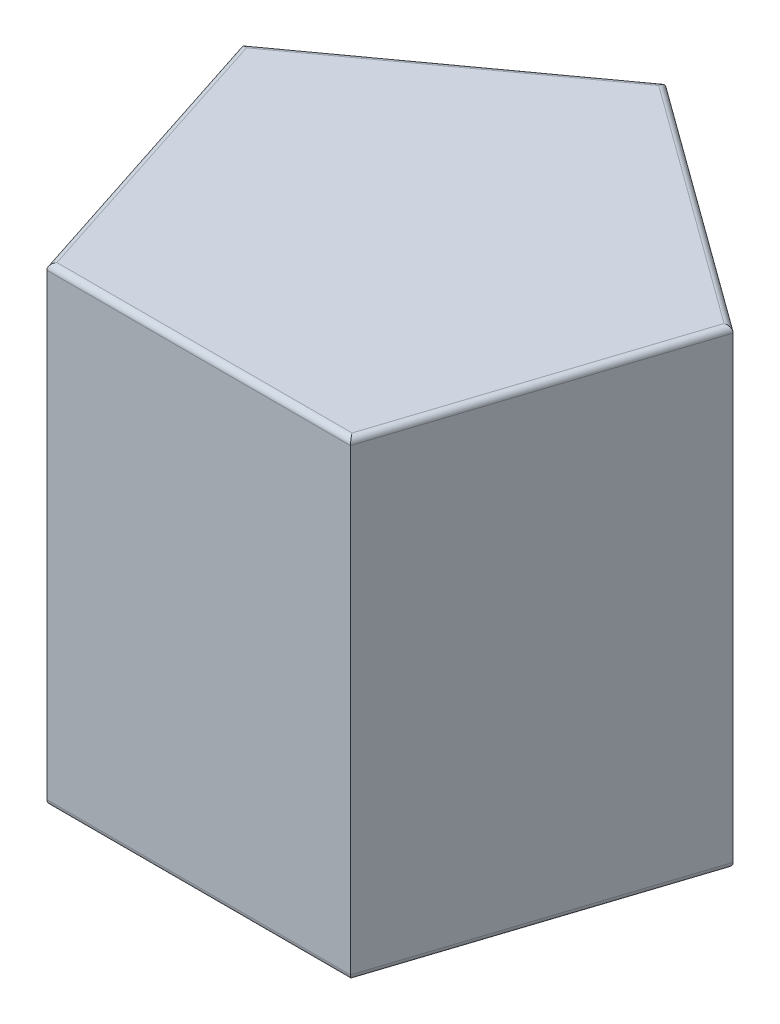
ISO-10303-21;
HEADER;
FILE_DESCRIPTION(('STEP AP214'),'2;1');
FILE_NAME('part.step','',(''),(''),'','','');
FILE_SCHEMA(('AUTOMOTIVE_DESIGN { 1 0 10303 214 1 1 1 1 }'));
ENDSEC;
DATA;
#1=APPLICATION_CONTEXT('core data for automotive mechanical design processes');
#2=APPLICATION_PROTOCOL_DEFINITION('international standard','automotive_design',2000,#1);
#3=PRODUCT_CONTEXT('',#1,'mechanical');
#4=PRODUCT('Part','Part','',(#3));
#5=PRODUCT_RELATED_PRODUCT_CATEGORY('part','',(#4));
#6=PRODUCT_DEFINITION_FORMATION('','',#4);
#7=PRODUCT_DEFINITION_CONTEXT('part definition',#1,'design');
#8=PRODUCT_DEFINITION('design','',#6,#7);
#9=PRODUCT_DEFINITION_SHAPE('','',#8);
#10=(LENGTH_UNIT() NAMED_UNIT(*) SI_UNIT(.MILLI.,.METRE.));
#11=(NAMED_UNIT(*) PLANE_ANGLE_UNIT() SI_UNIT($,.RADIAN.));
#12=(NAMED_UNIT(*) SI_UNIT($,.STERADIAN.) SOLID_ANGLE_UNIT());
#13=UNCERTAINTY_MEASURE_WITH_UNIT(LENGTH_MEASURE(1.E-05),#10,'distance_accuracy_value','');
#14=(GEOMETRIC_REPRESENTATION_CONTEXT(3) GLOBAL_UNCERTAINTY_ASSIGNED_CONTEXT((#13)) GLOBAL_UNIT_ASSIGNED_CONTEXT((#10,
#11,#12)) REPRESENTATION_CONTEXT('',''));
#15=CARTESIAN_POINT('',(0.,0.,0.));
#16=DIRECTION('',(0.,0.,1.));
#17=DIRECTION('',(1.,0.,0.));
#18=AXIS2_PLACEMENT_3D('',#15,#16,#17);
#19=CARTESIAN_POINT('',(12.9200844857088,40.,17.782971123159));
#20=DIRECTION('',(0.,0.,-1.));
#21=DIRECTION('',(-1.,0.,0.));
#22=AXIS2_PLACEMENT_3D('',#19,#20,#21);
#23=PLANE('',#22);
#24=DIRECTION('',(0.,-1.,0.));
#25=VECTOR('',#24,1.);
#26=CARTESIAN_POINT('',(-12.9200849418446,40.,17.782971123159));
#27=LINE('',#26,#25);
#28=CARTESIAN_POINT('',(-12.9200849418446,39.5,17.782971123159));
#29=VERTEX_POINT('',#28);
#30=CARTESIAN_POINT('',(-12.9200849418446,0.5,17.782971123159));
#31=VERTEX_POINT('',#30);
#32=EDGE_CURVE('E185',#29,#31,#27,.T.);
#33=ORIENTED_EDGE('',*,*,#32,.T.);
#34=DIRECTION('',(1.,0.,0.));
#35=VECTOR('',#34,1.);
#36=CARTESIAN_POINT('',(12.9200844857088,0.5,17.782971123159));
#37=LINE('',#36,#35);
#38=CARTESIAN_POINT('',(12.9200844857088,0.5,17.782971123159));
#39=VERTEX_POINT('',#38);
#40=EDGE_CURVE('E142',#31,#39,#37,.T.);
#41=ORIENTED_EDGE('',*,*,#40,.T.);
#42=DIRECTION('',(0.,-1.,0.));
#43=VECTOR('',#42,1.);
#44=CARTESIAN_POINT('',(12.9200844857088,40.,17.782971123159));
#45=LINE('',#44,#43);
#46=CARTESIAN_POINT('',(12.9200844857088,39.5,17.782971123159));
#47=VERTEX_POINT('',#46);
#48=EDGE_CURVE('E126',#47,#39,#45,.T.);
#49=ORIENTED_EDGE('',*,*,#48,.F.);
#50=DIRECTION('',(1.,0.,0.));
#51=VECTOR('',#50,1.);
#52=CARTESIAN_POINT('',(12.9200844857088,39.5,17.782971123159));
#53=LINE('',#52,#51);
#54=EDGE_CURVE('E139',#47,#29,#53,.F.);
#55=ORIENTED_EDGE('',*,*,#54,.T.);
#56=EDGE_LOOP('',(#33,#41,#49,#55));
#57=FACE_BOUND('',#56,.T.);
#58=ADVANCED_FACE('F43',(#57),#23,.F.);
#59=CARTESIAN_POINT('',(20.9051359763508,40.,-6.79249039308646));
#60=DIRECTION('',(-0.951056516295154,0.,-0.309016994374947));
#61=DIRECTION('',(-0.309016994374947,0.,0.951056516295154));
#62=AXIS2_PLACEMENT_3D('',#59,#60,#61);
#63=PLANE('',#62);
#64=ORIENTED_EDGE('',*,*,#48,.T.);
#65=DIRECTION('',(0.309016994374947,0.,-0.951056516295154));
#66=VECTOR('',#65,1.);
#67=CARTESIAN_POINT('',(20.9051359763508,0.5,-6.79249039308646));
#68=LINE('',#67,#66);
#69=CARTESIAN_POINT('',(20.9051359763508,0.5,-6.79249039308646));
#70=VERTEX_POINT('',#69);
#71=EDGE_CURVE('E132',#39,#70,#68,.T.);
#72=ORIENTED_EDGE('',*,*,#71,.T.);
#73=DIRECTION('',(0.,-1.,0.));
#74=VECTOR('',#73,1.);
#75=CARTESIAN_POINT('',(20.9051359763508,40.,-6.79249039308646));
#76=LINE('',#75,#74);
#77=CARTESIAN_POINT('',(20.9051359763508,39.5,-6.79249039308646));
#78=VERTEX_POINT('',#77);
#79=EDGE_CURVE('E128',#78,#70,#76,.T.);
#80=ORIENTED_EDGE('',*,*,#79,.F.);
#81=DIRECTION('',(0.309016994374947,0.,-0.951056516295154));
#82=VECTOR('',#81,1.);
#83=CARTESIAN_POINT('',(20.9051359763508,39.5,-6.79249039308646));
#84=LINE('',#83,#82);
#85=EDGE_CURVE('E123',#78,#47,#84,.F.);
#86=ORIENTED_EDGE('',*,*,#85,.T.);
#87=EDGE_LOOP('',(#64,#72,#80,#86));
#88=FACE_BOUND('',#87,.T.);
#89=ADVANCED_FACE('F125',(#88),#63,.F.);
#90=CARTESIAN_POINT('',(-2.28067847105658E-07,40.,-21.9809608993412));
#91=DIRECTION('',(-0.587785252292473,0.,0.809016994374947));
#92=DIRECTION('',(0.809016994374947,0.,0.587785252292473));
#93=AXIS2_PLACEMENT_3D('',#90,#91,#92);
#94=PLANE('',#93);
#95=ORIENTED_EDGE('',*,*,#79,.T.);
#96=DIRECTION('',(-0.809016994374947,0.,-0.587785252292473));
#97=VECTOR('',#96,1.);
#98=CARTESIAN_POINT('',(-2.28067847141139E-07,0.5,-21.9809608993412));
#99=LINE('',#98,#97);
#100=CARTESIAN_POINT('',(-2.28067847105658E-07,0.5,-21.9809608993412));
#101=VERTEX_POINT('',#100);
#102=EDGE_CURVE('E214',#70,#101,#99,.T.);
#103=ORIENTED_EDGE('',*,*,#102,.T.);
#104=DIRECTION('',(0.,-1.,0.));
#105=VECTOR('',#104,1.);
#106=CARTESIAN_POINT('',(-2.28067847105658E-07,40.,-21.9809608993412));
#107=LINE('',#106,#105);
#108=CARTESIAN_POINT('',(-2.28067847105658E-07,39.5,-21.9809608993412));
#109=VERTEX_POINT('',#108);
#110=EDGE_CURVE('E194',#109,#101,#107,.T.);
#111=ORIENTED_EDGE('',*,*,#110,.F.);
#112=DIRECTION('',(-0.809016994374947,0.,-0.587785252292473));
#113=VECTOR('',#112,1.);
#114=CARTESIAN_POINT('',(-2.28067847105658E-07,39.5,-21.9809608993412));
#115=LINE('',#114,#113);
#116=EDGE_CURVE('E212',#109,#78,#115,.F.);
#117=ORIENTED_EDGE('',*,*,#116,.T.);
#118=EDGE_LOOP('',(#95,#103,#111,#117));
#119=FACE_BOUND('',#118,.T.);
#120=ADVANCED_FACE('F261',(#119),#94,.F.);
#121=CARTESIAN_POINT('',(-20.9051364324865,40.,-6.79249039308645));
#122=DIRECTION('',(0.587785252292473,0.,0.809016994374947));
#123=DIRECTION('',(0.809016994374947,0.,-0.587785252292473));
#124=AXIS2_PLACEMENT_3D('',#121,#122,#123);
#125=PLANE('',#124);
#126=ORIENTED_EDGE('',*,*,#110,.T.);
#127=DIRECTION('',(-0.809016994374947,0.,0.587785252292473));
#128=VECTOR('',#127,1.);
#129=CARTESIAN_POINT('',(-20.9051364324865,0.5,-6.79249039308645));
#130=LINE('',#129,#128);
#131=CARTESIAN_POINT('',(-20.9051364324865,0.5,-6.79249039308645));
#132=VERTEX_POINT('',#131);
#133=EDGE_CURVE('E218',#101,#132,#130,.T.);
#134=ORIENTED_EDGE('',*,*,#133,.T.);
#135=DIRECTION('',(0.,-1.,0.));
#136=VECTOR('',#135,1.);
#137=CARTESIAN_POINT('',(-20.9051364324865,40.,-6.79249039308645));
#138=LINE('',#137,#136);
#139=CARTESIAN_POINT('',(-20.9051364324865,39.5,-6.79249039308645));
#140=VERTEX_POINT('',#139);
#141=EDGE_CURVE('E190',#140,#132,#138,.T.);
#142=ORIENTED_EDGE('',*,*,#141,.F.);
#143=DIRECTION('',(-0.809016994374947,0.,0.587785252292473));
#144=VECTOR('',#143,1.);
#145=CARTESIAN_POINT('',(-20.9051364324865,39.5,-6.79249039308645));
#146=LINE('',#145,#144);
#147=EDGE_CURVE('E216',#140,#109,#146,.F.);
#148=ORIENTED_EDGE('',*,*,#147,.T.);
#149=EDGE_LOOP('',(#126,#134,#142,#148));
#150=FACE_BOUND('',#149,.T.);
#151=ADVANCED_FACE('F238',(#150),#125,.F.);
#152=CARTESIAN_POINT('',(-12.9200849418446,40.,17.782971123159));
#153=DIRECTION('',(0.951056516295154,0.,-0.309016994374946));
#154=DIRECTION('',(-0.309016994374946,0.,-0.951056516295154));
#155=AXIS2_PLACEMENT_3D('',#152,#153,#154);
#156=PLANE('',#155);
#157=ORIENTED_EDGE('',*,*,#141,.T.);
#158=DIRECTION('',(0.309016994374946,0.,0.951056516295154));
#159=VECTOR('',#158,1.);
#160=CARTESIAN_POINT('',(-12.9200849418446,0.5,17.782971123159));
#161=LINE('',#160,#159);
#162=EDGE_CURVE('E222',#132,#31,#161,.T.);
#163=ORIENTED_EDGE('',*,*,#162,.T.);
#164=ORIENTED_EDGE('',*,*,#32,.F.);
#165=DIRECTION('',(0.309016994374946,0.,0.951056516295154));
#166=VECTOR('',#165,1.);
#167=CARTESIAN_POINT('',(-12.9200849418446,39.5,17.782971123159));
#168=LINE('',#167,#166);
#169=EDGE_CURVE('E220',#29,#140,#168,.F.);
#170=ORIENTED_EDGE('',*,*,#169,.T.);
#171=EDGE_LOOP('',(#157,#163,#164,#170));
#172=FACE_BOUND('',#171,.T.);
#173=ADVANCED_FACE('F236',(#172),#156,.F.);
#174=CARTESIAN_POINT('',(0.,40.,0.));
#175=DIRECTION('',(0.,-1.,0.));
#176=DIRECTION('',(0.,0.,-1.));
#177=AXIS2_PLACEMENT_3D('',#174,#175,#176);
#178=PLANE('',#177);
#179=DIRECTION('',(0.309016994374946,0.,0.951056516295154));
#180=VECTOR('',#179,1.);
#181=CARTESIAN_POINT('',(-16.4370824402027,40.,5.34073183342587));
#182=LINE('',#181,#180);
#183=CARTESIAN_POINT('',(-20.317351180194,40.,-6.6015073874614));
#184=VERTEX_POINT('',#183);
#185=CARTESIAN_POINT('',(-12.5568136778419,40.,17.282971123159));
#186=VERTEX_POINT('',#185);
#187=EDGE_CURVE('E224',#184,#186,#182,.T.);
#188=ORIENTED_EDGE('',*,*,#187,.T.);
#189=DIRECTION('',(1.,0.,0.));
#190=VECTOR('',#189,1.);
#191=CARTESIAN_POINT('',(0.,40.,17.282971123159));
#192=LINE('',#191,#190);
#193=CARTESIAN_POINT('',(12.5568132217062,40.,17.282971123159));
#194=VERTEX_POINT('',#193);
#195=EDGE_CURVE('E11',#186,#194,#192,.T.);
#196=ORIENTED_EDGE('',*,*,#195,.T.);
#197=DIRECTION('',(0.309016994374947,0.,-0.951056516295154));
#198=VECTOR('',#197,1.);
#199=CARTESIAN_POINT('',(16.437082027624,40.,5.34073169937096));
#200=LINE('',#199,#198);
#201=CARTESIAN_POINT('',(20.3173507240583,40.,-6.60150738746141));
#202=VERTEX_POINT('',#201);
#203=EDGE_CURVE('E52',#194,#202,#200,.T.);
#204=ORIENTED_EDGE('',*,*,#203,.T.);
#205=DIRECTION('',(-0.809016994374947,0.,-0.587785252292473));
#206=VECTOR('',#205,1.);
#207=CARTESIAN_POINT('',(10.158675343932,40.,-13.9822170793242));
#208=LINE('',#207,#206);
#209=CARTESIAN_POINT('',(-2.28067846005364E-07,40.,-21.3629269105913));
#210=VERTEX_POINT('',#209);
#211=EDGE_CURVE('E228',#202,#210,#208,.T.);
#212=ORIENTED_EDGE('',*,*,#211,.T.);
#213=DIRECTION('',(-0.809016994374947,0.,0.587785252292473));
#214=VECTOR('',#213,1.);
#215=CARTESIAN_POINT('',(-10.158675501523,40.,-13.9822172962297));
#216=LINE('',#215,#214);
#217=EDGE_CURVE('E226',#210,#184,#216,.T.);
#218=ORIENTED_EDGE('',*,*,#217,.T.);
#219=EDGE_LOOP('',(#188,#196,#204,#212,#218));
#220=FACE_BOUND('',#219,.T.);
#221=ADVANCED_FACE('F230',(#220),#178,.F.);
#222=CARTESIAN_POINT('',(0.,0.,0.));
#223=DIRECTION('',(0.,-1.,0.));
#224=DIRECTION('',(0.,0.,-1.));
#225=AXIS2_PLACEMENT_3D('',#222,#223,#224);
#226=PLANE('',#225);
#227=DIRECTION('',(0.309016994374947,0.,-0.951056516295154));
#228=VECTOR('',#227,1.);
#229=CARTESIAN_POINT('',(12.4445562275613,0.,17.6284626259715));
#230=LINE('',#229,#228);
#231=CARTESIAN_POINT('',(20.3173507240583,0.,-6.6015073874614));
#232=VERTEX_POINT('',#231);
#233=CARTESIAN_POINT('',(12.5568132217062,0.,17.282971123159));
#234=VERTEX_POINT('',#233);
#235=EDGE_CURVE('E207',#232,#234,#230,.F.);
#236=ORIENTED_EDGE('',*,*,#235,.T.);
#237=DIRECTION('',(1.,0.,0.));
#238=VECTOR('',#237,1.);
#239=CARTESIAN_POINT('',(-12.9200849418446,0.,17.282971123159));
#240=LINE('',#239,#238);
#241=CARTESIAN_POINT('',(-12.5568136778419,0.,17.282971123159));
#242=VERTEX_POINT('',#241);
#243=EDGE_CURVE('E133',#234,#242,#240,.F.);
#244=ORIENTED_EDGE('',*,*,#243,.T.);
#245=DIRECTION('',(0.309016994374946,0.,0.951056516295154));
#246=VECTOR('',#245,1.);
#247=CARTESIAN_POINT('',(-20.4296081743389,0.,-6.94699889027392));
#248=LINE('',#247,#246);
#249=CARTESIAN_POINT('',(-20.317351180194,0.,-6.6015073874614));
#250=VERTEX_POINT('',#249);
#251=EDGE_CURVE('E201',#242,#250,#248,.F.);
#252=ORIENTED_EDGE('',*,*,#251,.T.);
#253=DIRECTION('',(-0.809016994374947,0.,0.587785252292473));
#254=VECTOR('',#253,1.);
#255=CARTESIAN_POINT('',(0.29389239807839,0.,-21.5764524021537));
#256=LINE('',#255,#254);
#257=CARTESIAN_POINT('',(-2.28067847190472E-07,0.,-21.3629269105913));
#258=VERTEX_POINT('',#257);
#259=EDGE_CURVE('E203',#250,#258,#256,.F.);
#260=ORIENTED_EDGE('',*,*,#259,.T.);
#261=DIRECTION('',(-0.809016994374947,0.,-0.587785252292473));
#262=VECTOR('',#261,1.);
#263=CARTESIAN_POINT('',(20.6112433502046,0.,-6.38798189589898));
#264=LINE('',#263,#262);
#265=EDGE_CURVE('E205',#258,#232,#264,.F.);
#266=ORIENTED_EDGE('',*,*,#265,.T.);
#267=EDGE_LOOP('',(#236,#244,#252,#260,#266));
#268=FACE_BOUND('',#267,.T.);
#269=ADVANCED_FACE('F271',(#268),#226,.T.);
#270=CARTESIAN_POINT('',(-20.6112438063403,0.5,-6.38798189589897));
#271=DIRECTION('',(0.809016994374947,0.,-0.587785252292473));
#272=DIRECTION('',(-0.587785252292473,0.,-0.809016994374947));
#273=AXIS2_PLACEMENT_3D('',#270,#271,#272);
#274=CYLINDRICAL_SURFACE('',#273,0.5);
#275=CARTESIAN_POINT('',(-20.317351180194,0.5,-6.6015073874614));
#276=DIRECTION('',(0.309016994374948,0.,-0.951056516295153));
#277=DIRECTION('',(-0.951056516295153,0.,-0.309016994374948));
#278=AXIS2_PLACEMENT_3D('',#275,#276,#277);
#279=ELLIPSE('',#278,0.618033988749894,0.5);
#280=EDGE_CURVE('E178',#132,#250,#279,.F.);
#281=ORIENTED_EDGE('',*,*,#280,.F.);
#282=ORIENTED_EDGE('',*,*,#133,.F.);
#283=CARTESIAN_POINT('',(-2.28067845967246E-07,0.5,-21.3629269105913));
#284=DIRECTION('',(1.,0.,0.));
#285=DIRECTION('',(0.,0.,-1.));
#286=AXIS2_PLACEMENT_3D('',#283,#284,#285);
#287=ELLIPSE('',#286,0.618033988749895,0.5);
#288=EDGE_CURVE('E154',#258,#101,#287,.T.);
#289=ORIENTED_EDGE('',*,*,#288,.F.);
#290=ORIENTED_EDGE('',*,*,#259,.F.);
#291=EDGE_LOOP('',(#281,#282,#289,#290));
#292=FACE_BOUND('',#291,.T.);
#293=ADVANCED_FACE('F242',(#292),#274,.T.);
#294=CARTESIAN_POINT('',(-0.293892854214084,0.5,-21.5764524021537));
#295=DIRECTION('',(0.809016994374947,0.,0.587785252292473));
#296=DIRECTION('',(0.587785252292473,0.,-0.809016994374947));
#297=AXIS2_PLACEMENT_3D('',#294,#295,#296);
#298=CYLINDRICAL_SURFACE('',#297,0.5);
#299=ORIENTED_EDGE('',*,*,#288,.T.);
#300=ORIENTED_EDGE('',*,*,#102,.F.);
#301=CARTESIAN_POINT('',(20.3173507240583,0.5,-6.6015073874614));
#302=DIRECTION('',(0.309016994374947,0.,0.951056516295154));
#303=DIRECTION('',(0.951056516295154,0.,-0.309016994374947));
#304=AXIS2_PLACEMENT_3D('',#301,#302,#303);
#305=ELLIPSE('',#304,0.618033988749895,0.5);
#306=EDGE_CURVE('E173',#232,#70,#305,.T.);
#307=ORIENTED_EDGE('',*,*,#306,.F.);
#308=ORIENTED_EDGE('',*,*,#265,.F.);
#309=EDGE_LOOP('',(#299,#300,#307,#308));
#310=FACE_BOUND('',#309,.T.);
#311=ADVANCED_FACE('F292',(#310),#298,.T.);
#312=CARTESIAN_POINT('',(-12.444556683697,0.5,17.6284626259715));
#313=DIRECTION('',(-0.309016994374946,0.,-0.951056516295154));
#314=DIRECTION('',(-0.951056516295154,0.,0.309016994374946));
#315=AXIS2_PLACEMENT_3D('',#312,#313,#314);
#316=CYLINDRICAL_SURFACE('',#315,0.5);
#317=ORIENTED_EDGE('',*,*,#280,.T.);
#318=ORIENTED_EDGE('',*,*,#251,.F.);
#319=CARTESIAN_POINT('',(-12.5568136778419,0.5,17.282971123159));
#320=DIRECTION('',(-0.809016994374947,0.,-0.587785252292473));
#321=DIRECTION('',(0.587785252292474,0.,-0.809016994374947));
#322=AXIS2_PLACEMENT_3D('',#319,#320,#321);
#323=ELLIPSE('',#322,0.618033988749895,0.5);
#324=EDGE_CURVE('E167',#31,#242,#323,.F.);
#325=ORIENTED_EDGE('',*,*,#324,.F.);
#326=ORIENTED_EDGE('',*,*,#162,.F.);
#327=EDGE_LOOP('',(#317,#318,#325,#326));
#328=FACE_BOUND('',#327,.T.);
#329=ADVANCED_FACE('F244',(#328),#316,.T.);
#330=CARTESIAN_POINT('',(20.4296077182032,0.5,-6.94699889027393));
#331=DIRECTION('',(-0.309016994374947,0.,0.951056516295154));
#332=DIRECTION('',(0.951056516295154,0.,0.309016994374947));
#333=AXIS2_PLACEMENT_3D('',#330,#331,#332);
#334=CYLINDRICAL_SURFACE('',#333,0.5);
#335=ORIENTED_EDGE('',*,*,#306,.T.);
#336=ORIENTED_EDGE('',*,*,#71,.F.);
#337=CARTESIAN_POINT('',(12.5568132217062,0.5,17.282971123159));
#338=DIRECTION('',(-0.809016994374947,0.,0.587785252292473));
#339=DIRECTION('',(0.587785252292473,0.,0.809016994374947));
#340=AXIS2_PLACEMENT_3D('',#337,#338,#339);
#341=ELLIPSE('',#340,0.618033988749895,0.5);
#342=EDGE_CURVE('E163',#234,#39,#341,.T.);
#343=ORIENTED_EDGE('',*,*,#342,.F.);
#344=ORIENTED_EDGE('',*,*,#235,.F.);
#345=EDGE_LOOP('',(#335,#336,#343,#344));
#346=FACE_BOUND('',#345,.T.);
#347=ADVANCED_FACE('F247',(#346),#334,.T.);
#348=CARTESIAN_POINT('',(12.9200844857088,0.5,17.282971123159));
#349=DIRECTION('',(-1.,0.,0.));
#350=DIRECTION('',(0.,0.,1.));
#351=AXIS2_PLACEMENT_3D('',#348,#349,#350);
#352=CYLINDRICAL_SURFACE('',#351,0.5);
#353=ORIENTED_EDGE('',*,*,#324,.T.);
#354=ORIENTED_EDGE('',*,*,#243,.F.);
#355=ORIENTED_EDGE('',*,*,#342,.T.);
#356=ORIENTED_EDGE('',*,*,#40,.F.);
#357=EDGE_LOOP('',(#353,#354,#355,#356));
#358=FACE_BOUND('',#357,.T.);
#359=ADVANCED_FACE('F245',(#358),#352,.T.);
#360=CARTESIAN_POINT('',(-10.158675501523,39.5,-13.9822172962297));
#361=DIRECTION('',(-0.809016994374947,0.,0.587785252292473));
#362=DIRECTION('',(0.587785252292473,0.,0.809016994374947));
#363=AXIS2_PLACEMENT_3D('',#360,#361,#362);
#364=CYLINDRICAL_SURFACE('',#363,0.5);
#365=CARTESIAN_POINT('',(-20.317351180194,39.5,-6.6015073874614));
#366=DIRECTION('',(-0.309016994374948,0.,0.951056516295153));
#367=DIRECTION('',(0.951056516295153,0.,0.309016994374948));
#368=AXIS2_PLACEMENT_3D('',#365,#366,#367);
#369=ELLIPSE('',#368,0.618033988749894,0.5);
#370=EDGE_CURVE('E157',#184,#140,#369,.T.);
#371=ORIENTED_EDGE('',*,*,#370,.F.);
#372=ORIENTED_EDGE('',*,*,#217,.F.);
#373=CARTESIAN_POINT('',(-2.28067845858826E-07,39.5,-21.3629269105913));
#374=DIRECTION('',(-1.,0.,0.));
#375=DIRECTION('',(0.,0.,1.));
#376=AXIS2_PLACEMENT_3D('',#373,#374,#375);
#377=ELLIPSE('',#376,0.618033988749895,0.5);
#378=EDGE_CURVE('E47',#109,#210,#377,.F.);
#379=ORIENTED_EDGE('',*,*,#378,.F.);
#380=ORIENTED_EDGE('',*,*,#147,.F.);
#381=EDGE_LOOP('',(#371,#372,#379,#380));
#382=FACE_BOUND('',#381,.T.);
#383=ADVANCED_FACE('F45',(#382),#364,.T.);
#384=CARTESIAN_POINT('',(10.158675343932,39.5,-13.9822170793242));
#385=DIRECTION('',(-0.809016994374947,0.,-0.587785252292473));
#386=DIRECTION('',(-0.587785252292473,0.,0.809016994374947));
#387=AXIS2_PLACEMENT_3D('',#384,#385,#386);
#388=CYLINDRICAL_SURFACE('',#387,0.5);
#389=ORIENTED_EDGE('',*,*,#378,.T.);
#390=ORIENTED_EDGE('',*,*,#211,.F.);
#391=CARTESIAN_POINT('',(20.3173507240583,39.5,-6.60150738746141));
#392=DIRECTION('',(-0.309016994374947,0.,-0.951056516295154));
#393=DIRECTION('',(-0.951056516295154,0.,0.309016994374947));
#394=AXIS2_PLACEMENT_3D('',#391,#392,#393);
#395=ELLIPSE('',#394,0.618033988749895,0.5);
#396=EDGE_CURVE('E151',#78,#202,#395,.F.);
#397=ORIENTED_EDGE('',*,*,#396,.F.);
#398=ORIENTED_EDGE('',*,*,#116,.F.);
#399=EDGE_LOOP('',(#389,#390,#397,#398));
#400=FACE_BOUND('',#399,.T.);
#401=ADVANCED_FACE('F253',(#400),#388,.T.);
#402=CARTESIAN_POINT('',(-16.4370824402027,39.5,5.34073183342587));
#403=DIRECTION('',(0.309016994374946,0.,0.951056516295154));
#404=DIRECTION('',(0.951056516295154,0.,-0.309016994374946));
#405=AXIS2_PLACEMENT_3D('',#402,#403,#404);
#406=CYLINDRICAL_SURFACE('',#405,0.5);
#407=ORIENTED_EDGE('',*,*,#370,.T.);
#408=ORIENTED_EDGE('',*,*,#169,.F.);
#409=CARTESIAN_POINT('',(-12.5568136778419,39.5,17.282971123159));
#410=DIRECTION('',(0.809016994374947,0.,0.587785252292473));
#411=DIRECTION('',(-0.587785252292474,0.,0.809016994374947));
#412=AXIS2_PLACEMENT_3D('',#409,#410,#411);
#413=ELLIPSE('',#412,0.618033988749895,0.5);
#414=EDGE_CURVE('E146',#186,#29,#413,.T.);
#415=ORIENTED_EDGE('',*,*,#414,.F.);
#416=ORIENTED_EDGE('',*,*,#187,.F.);
#417=EDGE_LOOP('',(#407,#408,#415,#416));
#418=FACE_BOUND('',#417,.T.);
#419=ADVANCED_FACE('F233',(#418),#406,.T.);
#420=CARTESIAN_POINT('',(16.437082027624,39.5,5.34073169937096));
#421=DIRECTION('',(0.309016994374947,0.,-0.951056516295154));
#422=DIRECTION('',(-0.951056516295154,0.,-0.309016994374947));
#423=AXIS2_PLACEMENT_3D('',#420,#421,#422);
#424=CYLINDRICAL_SURFACE('',#423,0.5);
#425=ORIENTED_EDGE('',*,*,#396,.T.);
#426=ORIENTED_EDGE('',*,*,#203,.F.);
#427=CARTESIAN_POINT('',(12.5568132217062,39.5,17.282971123159));
#428=DIRECTION('',(0.809016994374947,0.,-0.587785252292473));
#429=DIRECTION('',(-0.587785252292473,0.,-0.809016994374947));
#430=AXIS2_PLACEMENT_3D('',#427,#428,#429);
#431=ELLIPSE('',#430,0.618033988749895,0.5);
#432=EDGE_CURVE('E60',#47,#194,#431,.F.);
#433=ORIENTED_EDGE('',*,*,#432,.F.);
#434=ORIENTED_EDGE('',*,*,#85,.F.);
#435=EDGE_LOOP('',(#425,#426,#433,#434));
#436=FACE_BOUND('',#435,.T.);
#437=ADVANCED_FACE('F149',(#436),#424,.T.);
#438=CARTESIAN_POINT('',(0.,39.5,17.282971123159));
#439=DIRECTION('',(1.,0.,0.));
#440=DIRECTION('',(0.,0.,-1.));
#441=AXIS2_PLACEMENT_3D('',#438,#439,#440);
#442=CYLINDRICAL_SURFACE('',#441,0.5);
#443=ORIENTED_EDGE('',*,*,#414,.T.);
#444=ORIENTED_EDGE('',*,*,#54,.F.);
#445=ORIENTED_EDGE('',*,*,#432,.T.);
#446=ORIENTED_EDGE('',*,*,#195,.F.);
#447=EDGE_LOOP('',(#443,#444,#445,#446));
#448=FACE_BOUND('',#447,.T.);
#449=ADVANCED_FACE('F144',(#448),#442,.T.);
#450=CLOSED_SHELL('',(#58,#89,#120,#151,#173,#221,#269,#293,#311,#329,#347,#359,#383,#401,#419,
#437,#449));
#451=MANIFOLD_SOLID_BREP('B2',#450);
#452=ADVANCED_BREP_SHAPE_REPRESENTATION('',(#18,#451),#14);
#453=SHAPE_DEFINITION_REPRESENTATION(#9,#452);
ENDSEC;
END-ISO-10303-21;
